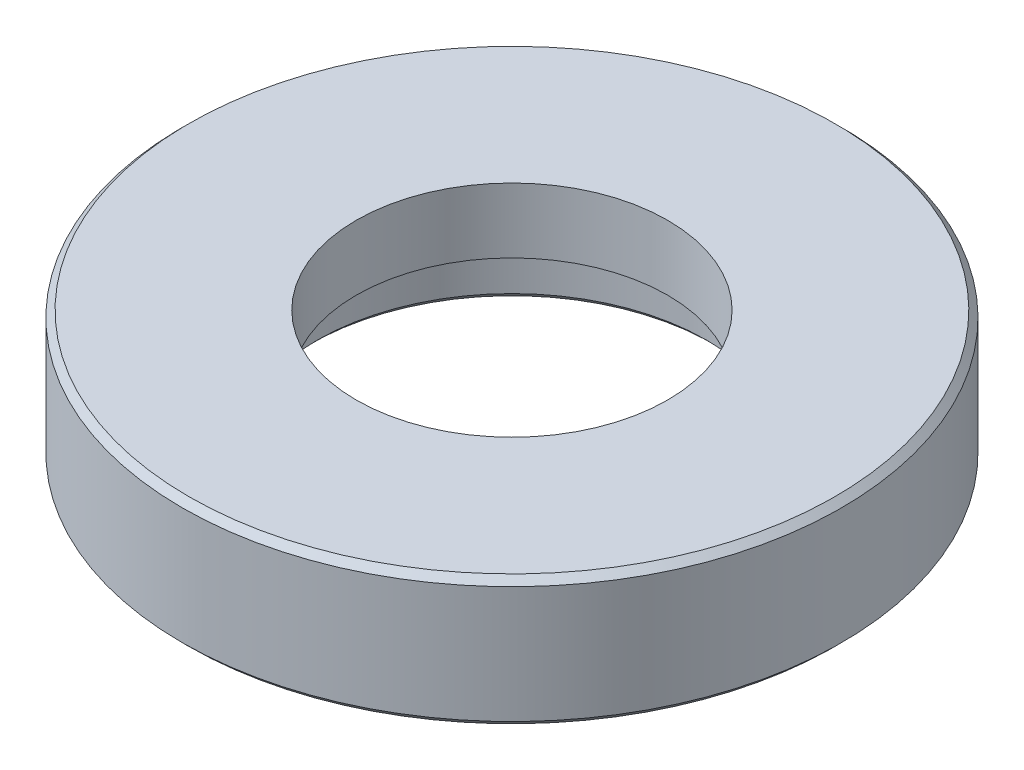
ISO-10303-21;
HEADER;
FILE_DESCRIPTION(('STEP AP214'),'2;1');
FILE_NAME('part.step','',(''),(''),'','','');
FILE_SCHEMA(('AUTOMOTIVE_DESIGN { 1 0 10303 214 1 1 1 1 }'));
ENDSEC;
DATA;
#1=APPLICATION_CONTEXT('core data for automotive mechanical design processes');
#2=APPLICATION_PROTOCOL_DEFINITION('international standard','automotive_design',2000,#1);
#3=PRODUCT_CONTEXT('',#1,'mechanical');
#4=PRODUCT('Part','Part','',(#3));
#5=PRODUCT_RELATED_PRODUCT_CATEGORY('part','',(#4));
#6=PRODUCT_DEFINITION_FORMATION('','',#4);
#7=PRODUCT_DEFINITION_CONTEXT('part definition',#1,'design');
#8=PRODUCT_DEFINITION('design','',#6,#7);
#9=PRODUCT_DEFINITION_SHAPE('','',#8);
#10=(LENGTH_UNIT() NAMED_UNIT(*) SI_UNIT(.MILLI.,.METRE.));
#11=(NAMED_UNIT(*) PLANE_ANGLE_UNIT() SI_UNIT($,.RADIAN.));
#12=(NAMED_UNIT(*) SI_UNIT($,.STERADIAN.) SOLID_ANGLE_UNIT());
#13=UNCERTAINTY_MEASURE_WITH_UNIT(LENGTH_MEASURE(1.E-05),#10,'distance_accuracy_value','');
#14=(GEOMETRIC_REPRESENTATION_CONTEXT(3) GLOBAL_UNCERTAINTY_ASSIGNED_CONTEXT((#13)) GLOBAL_UNIT_ASSIGNED_CONTEXT((#10,
#11,#12)) REPRESENTATION_CONTEXT('',''));
#15=CARTESIAN_POINT('',(0.,0.,0.));
#16=DIRECTION('',(0.,0.,1.));
#17=DIRECTION('',(1.,0.,0.));
#18=AXIS2_PLACEMENT_3D('',#15,#16,#17);
#19=CARTESIAN_POINT('',(0.,5.,0.));
#20=DIRECTION('',(0.,-1.,0.));
#21=DIRECTION('',(0.,0.,-1.));
#22=AXIS2_PLACEMENT_3D('',#19,#20,#21);
#23=CYLINDRICAL_SURFACE('',#22,12.7);
#24=CARTESIAN_POINT('',(0.,4.75,0.));
#25=DIRECTION('',(0.,1.,0.));
#26=DIRECTION('',(0.,0.,1.));
#27=AXIS2_PLACEMENT_3D('',#24,#25,#26);
#28=CIRCLE('',#27,12.7);
#29=CARTESIAN_POINT('',(0.,4.75,12.7));
#30=VERTEX_POINT('',#29);
#31=EDGE_CURVE('E46',#30,#30,#28,.F.);
#32=ORIENTED_EDGE('',*,*,#31,.T.);
#33=EDGE_LOOP('',(#32));
#34=FACE_BOUND('',#33,.T.);
#35=CARTESIAN_POINT('',(0.,0.250000000000002,0.));
#36=DIRECTION('',(0.,1.,0.));
#37=DIRECTION('',(0.,0.,1.));
#38=AXIS2_PLACEMENT_3D('',#35,#36,#37);
#39=CIRCLE('',#38,12.7);
#40=CARTESIAN_POINT('',(0.,0.250000000000002,12.7));
#41=VERTEX_POINT('',#40);
#42=EDGE_CURVE('E51',#41,#41,#39,.T.);
#43=ORIENTED_EDGE('',*,*,#42,.T.);
#44=EDGE_LOOP('',(#43));
#45=FACE_BOUND('',#44,.T.);
#46=ADVANCED_FACE('F31',(#34,#45),#23,.T.);
#47=CARTESIAN_POINT('',(0.,5.,0.));
#48=DIRECTION('',(0.,1.,0.));
#49=DIRECTION('',(0.,0.,1.));
#50=AXIS2_PLACEMENT_3D('',#47,#48,#49);
#51=PLANE('',#50);
#52=CARTESIAN_POINT('',(0.,5.,0.));
#53=DIRECTION('',(0.,1.,0.));
#54=DIRECTION('',(0.,0.,1.));
#55=AXIS2_PLACEMENT_3D('',#52,#53,#54);
#56=CIRCLE('',#55,12.45);
#57=CARTESIAN_POINT('',(0.,5.,12.45));
#58=VERTEX_POINT('',#57);
#59=EDGE_CURVE('E54',#58,#58,#56,.T.);
#60=ORIENTED_EDGE('',*,*,#59,.T.);
#61=EDGE_LOOP('',(#60));
#62=FACE_BOUND('',#61,.T.);
#63=CARTESIAN_POINT('',(0.,5.,0.));
#64=DIRECTION('',(0.,1.,0.));
#65=DIRECTION('',(0.,0.,1.));
#66=AXIS2_PLACEMENT_3D('',#63,#64,#65);
#67=CIRCLE('',#66,6.);
#68=CARTESIAN_POINT('',(0.,5.,6.));
#69=VERTEX_POINT('',#68);
#70=EDGE_CURVE('E57',#69,#69,#67,.T.);
#71=ORIENTED_EDGE('',*,*,#70,.F.);
#72=EDGE_LOOP('',(#71));
#73=FACE_BOUND('',#72,.T.);
#74=ADVANCED_FACE('F78',(#62,#73),#51,.T.);
#75=CARTESIAN_POINT('',(0.,0.,0.));
#76=DIRECTION('',(0.,1.,0.));
#77=DIRECTION('',(0.,0.,1.));
#78=AXIS2_PLACEMENT_3D('',#75,#76,#77);
#79=PLANE('',#78);
#80=CARTESIAN_POINT('',(0.,0.,0.));
#81=DIRECTION('',(0.,1.,0.));
#82=DIRECTION('',(0.,0.,1.));
#83=AXIS2_PLACEMENT_3D('',#80,#81,#82);
#84=CIRCLE('',#83,7.75);
#85=CARTESIAN_POINT('',(0.,0.,7.75));
#86=VERTEX_POINT('',#85);
#87=EDGE_CURVE('E38',#86,#86,#84,.T.);
#88=ORIENTED_EDGE('',*,*,#87,.T.);
#89=EDGE_LOOP('',(#88));
#90=FACE_BOUND('',#89,.T.);
#91=CARTESIAN_POINT('',(0.,0.,0.));
#92=DIRECTION('',(0.,1.,0.));
#93=DIRECTION('',(0.,0.,1.));
#94=AXIS2_PLACEMENT_3D('',#91,#92,#93);
#95=CIRCLE('',#94,12.45);
#96=CARTESIAN_POINT('',(0.,0.,12.45));
#97=VERTEX_POINT('',#96);
#98=EDGE_CURVE('E42',#97,#97,#95,.F.);
#99=ORIENTED_EDGE('',*,*,#98,.T.);
#100=EDGE_LOOP('',(#99));
#101=FACE_BOUND('',#100,.T.);
#102=ADVANCED_FACE('F74',(#90,#101),#79,.F.);
#103=CARTESIAN_POINT('',(0.,21.9705627484771,0.));
#104=DIRECTION('',(0.,-1.,0.));
#105=DIRECTION('',(0.,0.,-1.));
#106=AXIS2_PLACEMENT_3D('',#103,#104,#105);
#107=CYLINDRICAL_SURFACE('',#106,6.);
#108=CARTESIAN_POINT('',(0.,2.5,0.));
#109=DIRECTION('',(0.,1.,0.));
#110=DIRECTION('',(0.,0.,1.));
#111=AXIS2_PLACEMENT_3D('',#108,#109,#110);
#112=CIRCLE('',#111,6.);
#113=CARTESIAN_POINT('',(0.,2.5,6.));
#114=VERTEX_POINT('',#113);
#115=EDGE_CURVE('E63',#114,#114,#112,.T.);
#116=ORIENTED_EDGE('',*,*,#115,.F.);
#117=EDGE_LOOP('',(#116));
#118=FACE_BOUND('',#117,.T.);
#119=ORIENTED_EDGE('',*,*,#70,.T.);
#120=EDGE_LOOP('',(#119));
#121=FACE_BOUND('',#120,.T.);
#122=ADVANCED_FACE('F70',(#118,#121),#107,.F.);
#123=CARTESIAN_POINT('',(0.,2.5,0.));
#124=DIRECTION('',(0.,-1.,0.));
#125=DIRECTION('',(0.,0.,-1.));
#126=AXIS2_PLACEMENT_3D('',#123,#124,#125);
#127=CYLINDRICAL_SURFACE('',#126,7.5);
#128=CARTESIAN_POINT('',(0.,0.250000000000005,0.));
#129=DIRECTION('',(0.,1.,0.));
#130=DIRECTION('',(0.,0.,1.));
#131=AXIS2_PLACEMENT_3D('',#128,#129,#130);
#132=CIRCLE('',#131,7.5);
#133=CARTESIAN_POINT('',(0.,0.250000000000005,7.5));
#134=VERTEX_POINT('',#133);
#135=EDGE_CURVE('E10',#134,#134,#132,.F.);
#136=ORIENTED_EDGE('',*,*,#135,.T.);
#137=EDGE_LOOP('',(#136));
#138=FACE_BOUND('',#137,.T.);
#139=CARTESIAN_POINT('',(0.,2.5,0.));
#140=DIRECTION('',(0.,1.,0.));
#141=DIRECTION('',(0.,0.,1.));
#142=AXIS2_PLACEMENT_3D('',#139,#140,#141);
#143=CIRCLE('',#142,7.5);
#144=CARTESIAN_POINT('',(0.,2.5,7.5));
#145=VERTEX_POINT('',#144);
#146=EDGE_CURVE('E60',#145,#145,#143,.T.);
#147=ORIENTED_EDGE('',*,*,#146,.T.);
#148=EDGE_LOOP('',(#147));
#149=FACE_BOUND('',#148,.T.);
#150=ADVANCED_FACE('F73',(#138,#149),#127,.F.);
#151=CARTESIAN_POINT('',(0.,2.5,0.));
#152=DIRECTION('',(0.,1.,0.));
#153=DIRECTION('',(0.,0.,1.));
#154=AXIS2_PLACEMENT_3D('',#151,#152,#153);
#155=PLANE('',#154);
#156=ORIENTED_EDGE('',*,*,#115,.T.);
#157=EDGE_LOOP('',(#156));
#158=FACE_BOUND('',#157,.T.);
#159=ORIENTED_EDGE('',*,*,#146,.F.);
#160=EDGE_LOOP('',(#159));
#161=FACE_BOUND('',#160,.T.);
#162=ADVANCED_FACE('F67',(#158,#161),#155,.F.);
#163=CARTESIAN_POINT('',(0.,5.,0.));
#164=DIRECTION('',(0.,-1.,0.));
#165=DIRECTION('',(0.,0.,-1.));
#166=AXIS2_PLACEMENT_3D('',#163,#164,#165);
#167=CONICAL_SURFACE('',#166,12.45,0.785398163397455);
#168=ORIENTED_EDGE('',*,*,#31,.F.);
#169=EDGE_LOOP('',(#168));
#170=FACE_BOUND('',#169,.T.);
#171=ORIENTED_EDGE('',*,*,#59,.F.);
#172=EDGE_LOOP('',(#171));
#173=FACE_BOUND('',#172,.T.);
#174=ADVANCED_FACE('F91',(#170,#173),#167,.T.);
#175=CARTESIAN_POINT('',(0.,0.,0.));
#176=DIRECTION('',(0.,-1.,0.));
#177=DIRECTION('',(0.,0.,-1.));
#178=AXIS2_PLACEMENT_3D('',#175,#176,#177);
#179=CONICAL_SURFACE('',#178,7.75,0.785398163397443);
#180=ORIENTED_EDGE('',*,*,#135,.F.);
#181=EDGE_LOOP('',(#180));
#182=FACE_BOUND('',#181,.T.);
#183=ORIENTED_EDGE('',*,*,#87,.F.);
#184=EDGE_LOOP('',(#183));
#185=FACE_BOUND('',#184,.T.);
#186=ADVANCED_FACE('F93',(#182,#185),#179,.F.);
#187=CARTESIAN_POINT('',(0.,0.250000000000002,0.));
#188=DIRECTION('',(0.,1.,0.));
#189=DIRECTION('',(0.,0.,1.));
#190=AXIS2_PLACEMENT_3D('',#187,#188,#189);
#191=CONICAL_SURFACE('',#190,12.7,0.785398163397445);
#192=ORIENTED_EDGE('',*,*,#98,.F.);
#193=EDGE_LOOP('',(#192));
#194=FACE_BOUND('',#193,.T.);
#195=ORIENTED_EDGE('',*,*,#42,.F.);
#196=EDGE_LOOP('',(#195));
#197=FACE_BOUND('',#196,.T.);
#198=ADVANCED_FACE('F33',(#194,#197),#191,.T.);
#199=CLOSED_SHELL('',(#46,#74,#102,#122,#150,#162,#174,#186,#198));
#200=MANIFOLD_SOLID_BREP('B2',#199);
#201=ADVANCED_BREP_SHAPE_REPRESENTATION('',(#18,#200),#14);
#202=SHAPE_DEFINITION_REPRESENTATION(#9,#201);
ENDSEC;
END-ISO-10303-21;
